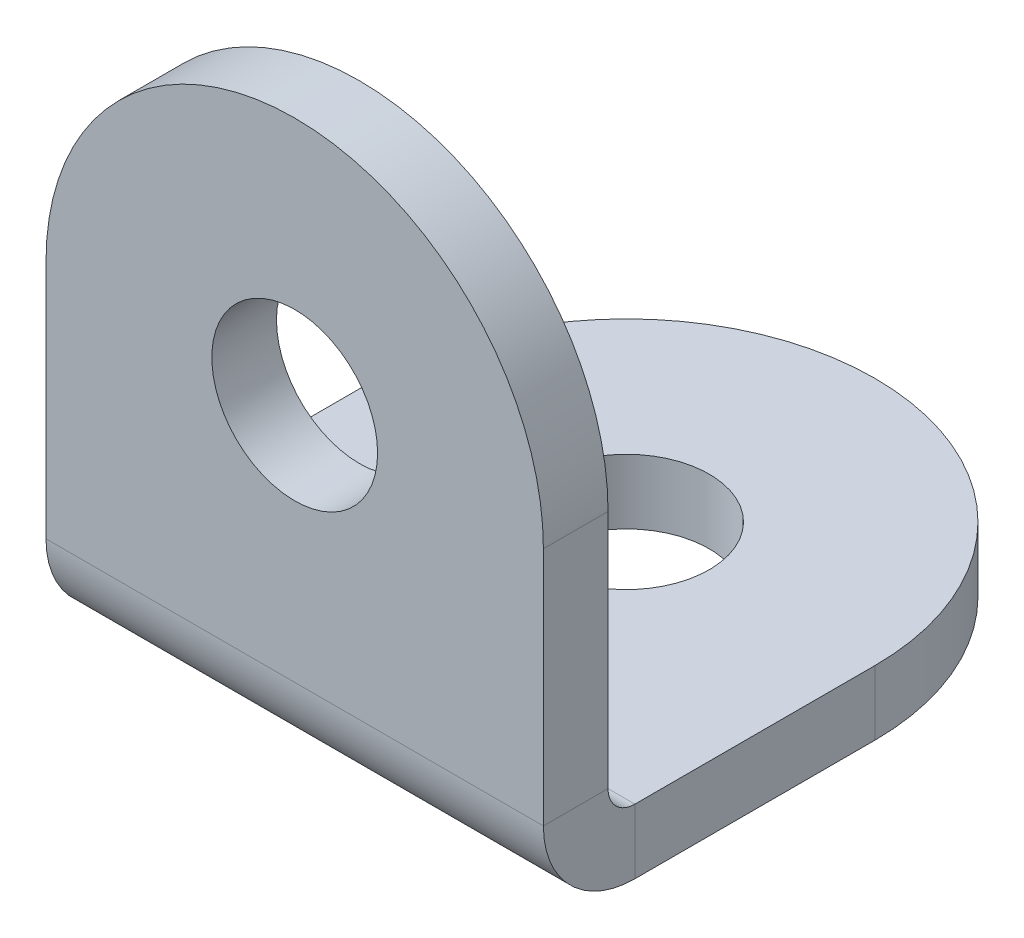
ISO-10303-21;
HEADER;
FILE_DESCRIPTION(('STEP AP214'),'2;1');
FILE_NAME('part.step','',(''),(''),'','','');
FILE_SCHEMA(('AUTOMOTIVE_DESIGN { 1 0 10303 214 1 1 1 1 }'));
ENDSEC;
DATA;
#1=APPLICATION_CONTEXT('core data for automotive mechanical design processes');
#2=APPLICATION_PROTOCOL_DEFINITION('international standard','automotive_design',2000,#1);
#3=PRODUCT_CONTEXT('',#1,'mechanical');
#4=PRODUCT('Part','Part','',(#3));
#5=PRODUCT_RELATED_PRODUCT_CATEGORY('part','',(#4));
#6=PRODUCT_DEFINITION_FORMATION('','',#4);
#7=PRODUCT_DEFINITION_CONTEXT('part definition',#1,'design');
#8=PRODUCT_DEFINITION('design','',#6,#7);
#9=PRODUCT_DEFINITION_SHAPE('','',#8);
#10=(LENGTH_UNIT() NAMED_UNIT(*) SI_UNIT(.MILLI.,.METRE.));
#11=(NAMED_UNIT(*) PLANE_ANGLE_UNIT() SI_UNIT($,.RADIAN.));
#12=(NAMED_UNIT(*) SI_UNIT($,.STERADIAN.) SOLID_ANGLE_UNIT());
#13=UNCERTAINTY_MEASURE_WITH_UNIT(LENGTH_MEASURE(1.E-05),#10,'distance_accuracy_value','');
#14=(GEOMETRIC_REPRESENTATION_CONTEXT(3) GLOBAL_UNCERTAINTY_ASSIGNED_CONTEXT((#13)) GLOBAL_UNIT_ASSIGNED_CONTEXT((#10,
#11,#12)) REPRESENTATION_CONTEXT('',''));
#15=CARTESIAN_POINT('',(0.,0.,0.));
#16=DIRECTION('',(0.,0.,1.));
#17=DIRECTION('',(1.,0.,0.));
#18=AXIS2_PLACEMENT_3D('',#15,#16,#17);
#19=CARTESIAN_POINT('',(-7.5,-10.,10.));
#20=DIRECTION('',(1.,0.,0.));
#21=DIRECTION('',(0.,0.,-1.));
#22=AXIS2_PLACEMENT_3D('',#19,#20,#21);
#23=PLANE('',#22);
#24=DIRECTION('',(0.,1.,0.));
#25=VECTOR('',#24,1.);
#26=CARTESIAN_POINT('',(-7.5,-10.05,0.));
#27=LINE('',#26,#25);
#28=CARTESIAN_POINT('',(-7.5,-10.,0.));
#29=VERTEX_POINT('',#28);
#30=CARTESIAN_POINT('',(-7.5,-8.05,0.));
#31=VERTEX_POINT('',#30);
#32=EDGE_CURVE('E58',#29,#31,#27,.T.);
#33=ORIENTED_EDGE('',*,*,#32,.F.);
#34=DIRECTION('',(0.,0.,-1.));
#35=VECTOR('',#34,1.);
#36=CARTESIAN_POINT('',(-7.5,-10.,10.));
#37=LINE('',#36,#35);
#38=CARTESIAN_POINT('',(-7.5,-10.,7.24));
#39=VERTEX_POINT('',#38);
#40=EDGE_CURVE('E164',#39,#29,#37,.T.);
#41=ORIENTED_EDGE('',*,*,#40,.F.);
#42=DIRECTION('',(0.,-1.,0.));
#43=VECTOR('',#42,1.);
#44=CARTESIAN_POINT('',(-7.5,-10.,7.24));
#45=LINE('',#44,#43);
#46=CARTESIAN_POINT('',(-7.5,-8.05,7.24));
#47=VERTEX_POINT('',#46);
#48=EDGE_CURVE('E51',#47,#39,#45,.T.);
#49=ORIENTED_EDGE('',*,*,#48,.F.);
#50=DIRECTION('',(0.,0.,1.));
#51=VECTOR('',#50,1.);
#52=CARTESIAN_POINT('',(-7.5,-8.05,10.));
#53=LINE('',#52,#51);
#54=EDGE_CURVE('E130',#47,#31,#53,.F.);
#55=ORIENTED_EDGE('',*,*,#54,.T.);
#56=EDGE_LOOP('',(#33,#41,#49,#55));
#57=FACE_BOUND('',#56,.T.);
#58=ADVANCED_FACE('F43',(#57),#23,.F.);
#59=CARTESIAN_POINT('',(7.5,-10.,10.));
#60=DIRECTION('',(1.,0.,0.));
#61=DIRECTION('',(0.,0.,-1.));
#62=AXIS2_PLACEMENT_3D('',#59,#60,#61);
#63=PLANE('',#62);
#64=DIRECTION('',(0.,1.,0.));
#65=VECTOR('',#64,1.);
#66=CARTESIAN_POINT('',(7.5,-10.05,0.));
#67=LINE('',#66,#65);
#68=CARTESIAN_POINT('',(7.5,-10.,0.));
#69=VERTEX_POINT('',#68);
#70=CARTESIAN_POINT('',(7.5,-8.05,0.));
#71=VERTEX_POINT('',#70);
#72=EDGE_CURVE('E107',#69,#71,#67,.T.);
#73=ORIENTED_EDGE('',*,*,#72,.T.);
#74=DIRECTION('',(0.,0.,1.));
#75=VECTOR('',#74,1.);
#76=CARTESIAN_POINT('',(7.5,-8.05,10.));
#77=LINE('',#76,#75);
#78=CARTESIAN_POINT('',(7.5,-8.05,7.24));
#79=VERTEX_POINT('',#78);
#80=EDGE_CURVE('E119',#79,#71,#77,.F.);
#81=ORIENTED_EDGE('',*,*,#80,.F.);
#82=DIRECTION('',(0.,-1.,0.));
#83=VECTOR('',#82,1.);
#84=CARTESIAN_POINT('',(7.5,-10.,7.24));
#85=LINE('',#84,#83);
#86=CARTESIAN_POINT('',(7.5,-10.,7.24));
#87=VERTEX_POINT('',#86);
#88=EDGE_CURVE('E146',#79,#87,#85,.T.);
#89=ORIENTED_EDGE('',*,*,#88,.T.);
#90=DIRECTION('',(0.,0.,-1.));
#91=VECTOR('',#90,1.);
#92=CARTESIAN_POINT('',(7.5,-10.,10.));
#93=LINE('',#92,#91);
#94=EDGE_CURVE('E121',#87,#69,#93,.T.);
#95=ORIENTED_EDGE('',*,*,#94,.T.);
#96=EDGE_LOOP('',(#73,#81,#89,#95));
#97=FACE_BOUND('',#96,.T.);
#98=ADVANCED_FACE('F118',(#97),#63,.T.);
#99=CARTESIAN_POINT('',(7.5,-7.24,7.24));
#100=DIRECTION('',(-1.,0.,0.));
#101=DIRECTION('',(0.,0.,1.));
#102=AXIS2_PLACEMENT_3D('',#99,#100,#101);
#103=PLANE('',#102);
#104=ORIENTED_EDGE('',*,*,#88,.F.);
#105=CARTESIAN_POINT('',(7.5,-7.24,7.24));
#106=DIRECTION('',(-1.,0.,0.));
#107=DIRECTION('',(0.,0.,1.));
#108=AXIS2_PLACEMENT_3D('',#105,#106,#107);
#109=CIRCLE('',#108,0.81);
#110=CARTESIAN_POINT('',(7.5,-7.24,8.05));
#111=VERTEX_POINT('',#110);
#112=EDGE_CURVE('E134',#79,#111,#109,.T.);
#113=ORIENTED_EDGE('',*,*,#112,.T.);
#114=DIRECTION('',(0.,0.,1.));
#115=VECTOR('',#114,1.);
#116=CARTESIAN_POINT('',(7.5,-7.24,10.));
#117=LINE('',#116,#115);
#118=CARTESIAN_POINT('',(7.5,-7.24,10.));
#119=VERTEX_POINT('',#118);
#120=EDGE_CURVE('E143',#111,#119,#117,.T.);
#121=ORIENTED_EDGE('',*,*,#120,.T.);
#122=CARTESIAN_POINT('',(7.5,-7.24,7.24));
#123=DIRECTION('',(1.,0.,0.));
#124=DIRECTION('',(0.,0.,-1.));
#125=AXIS2_PLACEMENT_3D('',#122,#123,#124);
#126=CIRCLE('',#125,2.76);
#127=EDGE_CURVE('E167',#87,#119,#126,.F.);
#128=ORIENTED_EDGE('',*,*,#127,.F.);
#129=EDGE_LOOP('',(#104,#113,#121,#128));
#130=FACE_BOUND('',#129,.T.);
#131=ADVANCED_FACE('F202',(#130),#103,.F.);
#132=CARTESIAN_POINT('',(7.5,-10.,10.));
#133=DIRECTION('',(1.,0.,0.));
#134=DIRECTION('',(0.,-1.,0.));
#135=AXIS2_PLACEMENT_3D('',#132,#133,#134);
#136=PLANE('',#135);
#137=DIRECTION('',(0.,0.,1.));
#138=VECTOR('',#137,1.);
#139=CARTESIAN_POINT('',(7.5,0.,8.));
#140=LINE('',#139,#138);
#141=CARTESIAN_POINT('',(7.5,0.,8.05));
#142=VERTEX_POINT('',#141);
#143=CARTESIAN_POINT('',(7.5,0.,10.));
#144=VERTEX_POINT('',#143);
#145=EDGE_CURVE('E65',#142,#144,#140,.T.);
#146=ORIENTED_EDGE('',*,*,#145,.T.);
#147=DIRECTION('',(0.,-1.,0.));
#148=VECTOR('',#147,1.);
#149=CARTESIAN_POINT('',(7.5,-10.,10.));
#150=LINE('',#149,#148);
#151=EDGE_CURVE('E171',#144,#119,#150,.T.);
#152=ORIENTED_EDGE('',*,*,#151,.T.);
#153=ORIENTED_EDGE('',*,*,#120,.F.);
#154=DIRECTION('',(0.,1.,0.));
#155=VECTOR('',#154,1.);
#156=CARTESIAN_POINT('',(7.5,-10.,8.05));
#157=LINE('',#156,#155);
#158=EDGE_CURVE('E132',#142,#111,#157,.F.);
#159=ORIENTED_EDGE('',*,*,#158,.F.);
#160=EDGE_LOOP('',(#146,#152,#153,#159));
#161=FACE_BOUND('',#160,.T.);
#162=ADVANCED_FACE('F195',(#161),#136,.T.);
#163=CARTESIAN_POINT('',(-7.5,-10.,10.));
#164=DIRECTION('',(1.,0.,0.));
#165=DIRECTION('',(0.,-1.,0.));
#166=AXIS2_PLACEMENT_3D('',#163,#164,#165);
#167=PLANE('',#166);
#168=DIRECTION('',(0.,0.,1.));
#169=VECTOR('',#168,1.);
#170=CARTESIAN_POINT('',(-7.5,0.,8.));
#171=LINE('',#170,#169);
#172=CARTESIAN_POINT('',(-7.5,0.,8.05));
#173=VERTEX_POINT('',#172);
#174=CARTESIAN_POINT('',(-7.5,0.,10.));
#175=VERTEX_POINT('',#174);
#176=EDGE_CURVE('E208',#173,#175,#171,.T.);
#177=ORIENTED_EDGE('',*,*,#176,.F.);
#178=DIRECTION('',(0.,1.,0.));
#179=VECTOR('',#178,1.);
#180=CARTESIAN_POINT('',(-7.5,-10.,8.05));
#181=LINE('',#180,#179);
#182=CARTESIAN_POINT('',(-7.5,-7.24,8.05));
#183=VERTEX_POINT('',#182);
#184=EDGE_CURVE('E129',#173,#183,#181,.F.);
#185=ORIENTED_EDGE('',*,*,#184,.T.);
#186=DIRECTION('',(0.,0.,1.));
#187=VECTOR('',#186,1.);
#188=CARTESIAN_POINT('',(-7.5,-7.24,10.));
#189=LINE('',#188,#187);
#190=CARTESIAN_POINT('',(-7.5,-7.24,10.));
#191=VERTEX_POINT('',#190);
#192=EDGE_CURVE('E147',#183,#191,#189,.T.);
#193=ORIENTED_EDGE('',*,*,#192,.T.);
#194=DIRECTION('',(0.,-1.,0.));
#195=VECTOR('',#194,1.);
#196=CARTESIAN_POINT('',(-7.5,-10.,10.));
#197=LINE('',#196,#195);
#198=EDGE_CURVE('E169',#175,#191,#197,.T.);
#199=ORIENTED_EDGE('',*,*,#198,.F.);
#200=EDGE_LOOP('',(#177,#185,#193,#199));
#201=FACE_BOUND('',#200,.T.);
#202=ADVANCED_FACE('F251',(#201),#167,.F.);
#203=CARTESIAN_POINT('',(-7.5,-7.24,7.24));
#204=DIRECTION('',(1.,0.,0.));
#205=DIRECTION('',(0.,0.,-1.));
#206=AXIS2_PLACEMENT_3D('',#203,#204,#205);
#207=PLANE('',#206);
#208=CARTESIAN_POINT('',(-7.5,-7.24,7.24));
#209=DIRECTION('',(-1.,0.,0.));
#210=DIRECTION('',(0.,0.,1.));
#211=AXIS2_PLACEMENT_3D('',#208,#209,#210);
#212=CIRCLE('',#211,0.81);
#213=EDGE_CURVE('E139',#183,#47,#212,.F.);
#214=ORIENTED_EDGE('',*,*,#213,.T.);
#215=ORIENTED_EDGE('',*,*,#48,.T.);
#216=CARTESIAN_POINT('',(-7.5,-7.24,7.24));
#217=DIRECTION('',(-1.,0.,0.));
#218=DIRECTION('',(0.,0.,1.));
#219=AXIS2_PLACEMENT_3D('',#216,#217,#218);
#220=CIRCLE('',#219,2.76);
#221=EDGE_CURVE('E178',#191,#39,#220,.F.);
#222=ORIENTED_EDGE('',*,*,#221,.F.);
#223=ORIENTED_EDGE('',*,*,#192,.F.);
#224=EDGE_LOOP('',(#214,#215,#222,#223));
#225=FACE_BOUND('',#224,.T.);
#226=ADVANCED_FACE('F45',(#225),#207,.F.);
#227=CARTESIAN_POINT('',(7.5,-10.,10.));
#228=DIRECTION('',(0.,0.,-1.));
#229=DIRECTION('',(-1.,0.,0.));
#230=AXIS2_PLACEMENT_3D('',#227,#228,#229);
#231=PLANE('',#230);
#232=CARTESIAN_POINT('',(0.,0.,10.));
#233=DIRECTION('',(0.,0.,1.));
#234=DIRECTION('',(1.,0.,0.));
#235=AXIS2_PLACEMENT_3D('',#232,#233,#234);
#236=CIRCLE('',#235,2.5);
#237=CARTESIAN_POINT('',(2.5,0.,10.));
#238=VERTEX_POINT('',#237);
#239=EDGE_CURVE('E153',#238,#238,#236,.T.);
#240=ORIENTED_EDGE('',*,*,#239,.F.);
#241=EDGE_LOOP('',(#240));
#242=FACE_BOUND('',#241,.T.);
#243=ORIENTED_EDGE('',*,*,#151,.F.);
#244=CARTESIAN_POINT('',(0.,0.,10.));
#245=DIRECTION('',(0.,0.,-1.));
#246=DIRECTION('',(-1.,0.,0.));
#247=AXIS2_PLACEMENT_3D('',#244,#245,#246);
#248=CIRCLE('',#247,7.5);
#249=EDGE_CURVE('E157',#175,#144,#248,.T.);
#250=ORIENTED_EDGE('',*,*,#249,.F.);
#251=ORIENTED_EDGE('',*,*,#198,.T.);
#252=DIRECTION('',(-1.,0.,0.));
#253=VECTOR('',#252,1.);
#254=CARTESIAN_POINT('',(7.5,-7.24,10.));
#255=LINE('',#254,#253);
#256=EDGE_CURVE('E151',#191,#119,#255,.F.);
#257=ORIENTED_EDGE('',*,*,#256,.T.);
#258=EDGE_LOOP('',(#243,#250,#251,#257));
#259=FACE_BOUND('',#258,.T.);
#260=ADVANCED_FACE('F217',(#242,#259),#231,.F.);
#261=CARTESIAN_POINT('',(7.5,-10.,10.));
#262=DIRECTION('',(0.,1.,0.));
#263=DIRECTION('',(0.,0.,1.));
#264=AXIS2_PLACEMENT_3D('',#261,#262,#263);
#265=PLANE('',#264);
#266=CARTESIAN_POINT('',(0.,-10.,0.));
#267=DIRECTION('',(0.,1.,0.));
#268=DIRECTION('',(0.,0.,1.));
#269=AXIS2_PLACEMENT_3D('',#266,#267,#268);
#270=CIRCLE('',#269,2.5);
#271=CARTESIAN_POINT('',(0.,-10.,2.5));
#272=VERTEX_POINT('',#271);
#273=EDGE_CURVE('E209',#272,#272,#270,.T.);
#274=ORIENTED_EDGE('',*,*,#273,.T.);
#275=EDGE_LOOP('',(#274));
#276=FACE_BOUND('',#275,.T.);
#277=ORIENTED_EDGE('',*,*,#40,.T.);
#278=CARTESIAN_POINT('',(0.,-10.,0.));
#279=DIRECTION('',(0.,1.,0.));
#280=DIRECTION('',(0.,0.,1.));
#281=AXIS2_PLACEMENT_3D('',#278,#279,#280);
#282=CIRCLE('',#281,7.5);
#283=EDGE_CURVE('E206',#29,#69,#282,.F.);
#284=ORIENTED_EDGE('',*,*,#283,.T.);
#285=ORIENTED_EDGE('',*,*,#94,.F.);
#286=DIRECTION('',(-1.,0.,0.));
#287=VECTOR('',#286,1.);
#288=CARTESIAN_POINT('',(7.5,-10.,7.24));
#289=LINE('',#288,#287);
#290=EDGE_CURVE('E173',#87,#39,#289,.T.);
#291=ORIENTED_EDGE('',*,*,#290,.T.);
#292=EDGE_LOOP('',(#277,#284,#285,#291));
#293=FACE_BOUND('',#292,.T.);
#294=ADVANCED_FACE('F205',(#276,#293),#265,.F.);
#295=CARTESIAN_POINT('',(7.5,-7.24,7.24));
#296=DIRECTION('',(-1.,0.,0.));
#297=DIRECTION('',(0.,0.,1.));
#298=AXIS2_PLACEMENT_3D('',#295,#296,#297);
#299=CYLINDRICAL_SURFACE('',#298,2.76);
#300=ORIENTED_EDGE('',*,*,#127,.T.);
#301=ORIENTED_EDGE('',*,*,#256,.F.);
#302=ORIENTED_EDGE('',*,*,#221,.T.);
#303=ORIENTED_EDGE('',*,*,#290,.F.);
#304=EDGE_LOOP('',(#300,#301,#302,#303));
#305=FACE_BOUND('',#304,.T.);
#306=ADVANCED_FACE('F221',(#305),#299,.T.);
#307=CARTESIAN_POINT('',(7.5,-10.,8.05));
#308=DIRECTION('',(0.,0.,-1.));
#309=DIRECTION('',(-1.,0.,0.));
#310=AXIS2_PLACEMENT_3D('',#307,#308,#309);
#311=PLANE('',#310);
#312=CARTESIAN_POINT('',(0.,0.,8.05));
#313=DIRECTION('',(0.,0.,-1.));
#314=DIRECTION('',(-1.,0.,0.));
#315=AXIS2_PLACEMENT_3D('',#312,#313,#314);
#316=CIRCLE('',#315,7.5);
#317=EDGE_CURVE('E11',#142,#173,#316,.F.);
#318=ORIENTED_EDGE('',*,*,#317,.F.);
#319=ORIENTED_EDGE('',*,*,#158,.T.);
#320=DIRECTION('',(-1.,0.,0.));
#321=VECTOR('',#320,1.);
#322=CARTESIAN_POINT('',(7.5,-7.24,8.05));
#323=LINE('',#322,#321);
#324=EDGE_CURVE('E181',#183,#111,#323,.F.);
#325=ORIENTED_EDGE('',*,*,#324,.F.);
#326=ORIENTED_EDGE('',*,*,#184,.F.);
#327=EDGE_LOOP('',(#318,#319,#325,#326));
#328=FACE_BOUND('',#327,.T.);
#329=CARTESIAN_POINT('',(0.,0.,8.05));
#330=DIRECTION('',(0.,0.,-1.));
#331=DIRECTION('',(-1.,0.,0.));
#332=AXIS2_PLACEMENT_3D('',#329,#330,#331);
#333=CIRCLE('',#332,2.5);
#334=CARTESIAN_POINT('',(-2.5,0.,8.05));
#335=VERTEX_POINT('',#334);
#336=EDGE_CURVE('E142',#335,#335,#333,.T.);
#337=ORIENTED_EDGE('',*,*,#336,.F.);
#338=EDGE_LOOP('',(#337));
#339=FACE_BOUND('',#338,.T.);
#340=ADVANCED_FACE('F190',(#328,#339),#311,.T.);
#341=CARTESIAN_POINT('',(7.5,-8.05,10.));
#342=DIRECTION('',(0.,1.,0.));
#343=DIRECTION('',(0.,0.,1.));
#344=AXIS2_PLACEMENT_3D('',#341,#342,#343);
#345=PLANE('',#344);
#346=CARTESIAN_POINT('',(0.,-8.05,0.));
#347=DIRECTION('',(0.,-1.,0.));
#348=DIRECTION('',(0.,0.,-1.));
#349=AXIS2_PLACEMENT_3D('',#346,#347,#348);
#350=CIRCLE('',#349,7.5);
#351=EDGE_CURVE('E104',#31,#71,#350,.T.);
#352=ORIENTED_EDGE('',*,*,#351,.F.);
#353=ORIENTED_EDGE('',*,*,#54,.F.);
#354=DIRECTION('',(1.,0.,0.));
#355=VECTOR('',#354,1.);
#356=CARTESIAN_POINT('',(7.5,-8.05,7.24));
#357=LINE('',#356,#355);
#358=EDGE_CURVE('E127',#79,#47,#357,.F.);
#359=ORIENTED_EDGE('',*,*,#358,.F.);
#360=ORIENTED_EDGE('',*,*,#80,.T.);
#361=EDGE_LOOP('',(#352,#353,#359,#360));
#362=FACE_BOUND('',#361,.T.);
#363=CARTESIAN_POINT('',(0.,-8.05,0.));
#364=DIRECTION('',(0.,1.,0.));
#365=DIRECTION('',(0.,0.,1.));
#366=AXIS2_PLACEMENT_3D('',#363,#364,#365);
#367=CIRCLE('',#366,2.5);
#368=CARTESIAN_POINT('',(0.,-8.05,2.5));
#369=VERTEX_POINT('',#368);
#370=EDGE_CURVE('E113',#369,#369,#367,.T.);
#371=ORIENTED_EDGE('',*,*,#370,.F.);
#372=EDGE_LOOP('',(#371));
#373=FACE_BOUND('',#372,.T.);
#374=ADVANCED_FACE('F124',(#362,#373),#345,.T.);
#375=CARTESIAN_POINT('',(7.5,-7.24,7.24));
#376=DIRECTION('',(-1.,0.,0.));
#377=DIRECTION('',(0.,0.,1.));
#378=AXIS2_PLACEMENT_3D('',#375,#376,#377);
#379=CYLINDRICAL_SURFACE('',#378,0.81);
#380=ORIENTED_EDGE('',*,*,#112,.F.);
#381=ORIENTED_EDGE('',*,*,#358,.T.);
#382=ORIENTED_EDGE('',*,*,#213,.F.);
#383=ORIENTED_EDGE('',*,*,#324,.T.);
#384=EDGE_LOOP('',(#380,#381,#382,#383));
#385=FACE_BOUND('',#384,.T.);
#386=ADVANCED_FACE('F201',(#385),#379,.F.);
#387=CARTESIAN_POINT('',(0.,0.,8.));
#388=DIRECTION('',(0.,0.,1.));
#389=DIRECTION('',(1.,0.,0.));
#390=AXIS2_PLACEMENT_3D('',#387,#388,#389);
#391=CYLINDRICAL_SURFACE('',#390,2.5);
#392=ORIENTED_EDGE('',*,*,#336,.T.);
#393=EDGE_LOOP('',(#392));
#394=FACE_BOUND('',#393,.T.);
#395=ORIENTED_EDGE('',*,*,#239,.T.);
#396=EDGE_LOOP('',(#395));
#397=FACE_BOUND('',#396,.T.);
#398=ADVANCED_FACE('F238',(#394,#397),#391,.F.);
#399=CARTESIAN_POINT('',(0.,0.,8.));
#400=DIRECTION('',(0.,0.,1.));
#401=DIRECTION('',(1.,0.,0.));
#402=AXIS2_PLACEMENT_3D('',#399,#400,#401);
#403=CYLINDRICAL_SURFACE('',#402,7.5);
#404=ORIENTED_EDGE('',*,*,#317,.T.);
#405=ORIENTED_EDGE('',*,*,#176,.T.);
#406=ORIENTED_EDGE('',*,*,#249,.T.);
#407=ORIENTED_EDGE('',*,*,#145,.F.);
#408=EDGE_LOOP('',(#404,#405,#406,#407));
#409=FACE_BOUND('',#408,.T.);
#410=ADVANCED_FACE('F258',(#409),#403,.T.);
#411=CARTESIAN_POINT('',(0.,-10.05,0.));
#412=DIRECTION('',(0.,1.,0.));
#413=DIRECTION('',(0.,0.,1.));
#414=AXIS2_PLACEMENT_3D('',#411,#412,#413);
#415=CYLINDRICAL_SURFACE('',#414,2.5);
#416=ORIENTED_EDGE('',*,*,#370,.T.);
#417=EDGE_LOOP('',(#416));
#418=FACE_BOUND('',#417,.T.);
#419=ORIENTED_EDGE('',*,*,#273,.F.);
#420=EDGE_LOOP('',(#419));
#421=FACE_BOUND('',#420,.T.);
#422=ADVANCED_FACE('F230',(#418,#421),#415,.F.);
#423=CARTESIAN_POINT('',(0.,-10.05,0.));
#424=DIRECTION('',(0.,1.,0.));
#425=DIRECTION('',(0.,0.,1.));
#426=AXIS2_PLACEMENT_3D('',#423,#424,#425);
#427=CYLINDRICAL_SURFACE('',#426,7.5);
#428=ORIENTED_EDGE('',*,*,#32,.T.);
#429=ORIENTED_EDGE('',*,*,#351,.T.);
#430=ORIENTED_EDGE('',*,*,#72,.F.);
#431=ORIENTED_EDGE('',*,*,#283,.F.);
#432=EDGE_LOOP('',(#428,#429,#430,#431));
#433=FACE_BOUND('',#432,.T.);
#434=ADVANCED_FACE('F106',(#433),#427,.T.);
#435=CLOSED_SHELL('',(#58,#98,#131,#162,#202,#226,#260,#294,#306,#340,#374,#386,#398,#410,#422,#434));
#436=MANIFOLD_SOLID_BREP('B2',#435);
#437=ADVANCED_BREP_SHAPE_REPRESENTATION('',(#18,#436),#14);
#438=SHAPE_DEFINITION_REPRESENTATION(#9,#437);
ENDSEC;
END-ISO-10303-21;
